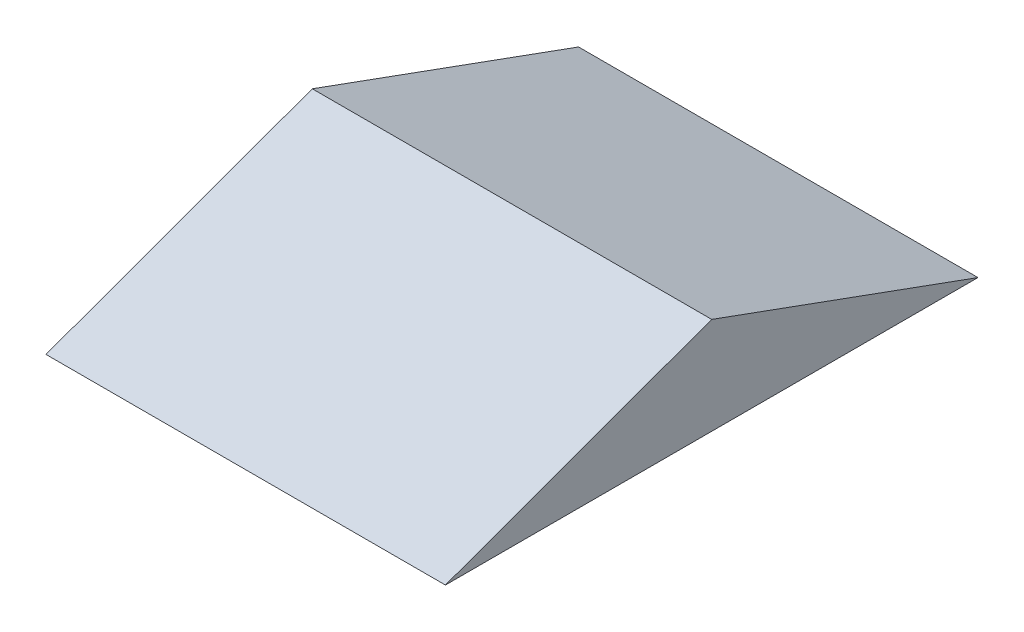
ISO-10303-21;
HEADER;
FILE_DESCRIPTION(('STEP AP214'),'2;1');
FILE_NAME('part.step','',(''),(''),'','','');
FILE_SCHEMA(('AUTOMOTIVE_DESIGN { 1 0 10303 214 1 1 1 1 }'));
ENDSEC;
DATA;
#1=APPLICATION_CONTEXT('core data for automotive mechanical design processes');
#2=APPLICATION_PROTOCOL_DEFINITION('international standard','automotive_design',2000,#1);
#3=PRODUCT_CONTEXT('',#1,'mechanical');
#4=PRODUCT('Part','Part','',(#3));
#5=PRODUCT_RELATED_PRODUCT_CATEGORY('part','',(#4));
#6=PRODUCT_DEFINITION_FORMATION('','',#4);
#7=PRODUCT_DEFINITION_CONTEXT('part definition',#1,'design');
#8=PRODUCT_DEFINITION('design','',#6,#7);
#9=PRODUCT_DEFINITION_SHAPE('','',#8);
#10=(LENGTH_UNIT() NAMED_UNIT(*) SI_UNIT(.MILLI.,.METRE.));
#11=(NAMED_UNIT(*) PLANE_ANGLE_UNIT() SI_UNIT($,.RADIAN.));
#12=(NAMED_UNIT(*) SI_UNIT($,.STERADIAN.) SOLID_ANGLE_UNIT());
#13=UNCERTAINTY_MEASURE_WITH_UNIT(LENGTH_MEASURE(1.E-05),#10,'distance_accuracy_value','');
#14=(GEOMETRIC_REPRESENTATION_CONTEXT(3) GLOBAL_UNCERTAINTY_ASSIGNED_CONTEXT((#13)) GLOBAL_UNIT_ASSIGNED_CONTEXT((#10,
#11,#12)) REPRESENTATION_CONTEXT('',''));
#15=CARTESIAN_POINT('',(0.,0.,0.));
#16=DIRECTION('',(0.,0.,1.));
#17=DIRECTION('',(1.,0.,0.));
#18=AXIS2_PLACEMENT_3D('',#15,#16,#17);
#19=CARTESIAN_POINT('',(75.,0.,100.));
#20=DIRECTION('',(0.,-0.939692620785908,-0.342020143325669));
#21=DIRECTION('',(0.,0.342020143325669,-0.939692620785908));
#22=AXIS2_PLACEMENT_3D('',#19,#20,#21);
#23=PLANE('',#22);
#24=DIRECTION('',(0.,-0.342020143325669,0.939692620785908));
#25=VECTOR('',#24,1.);
#26=CARTESIAN_POINT('',(-75.,0.,100.));
#27=LINE('',#26,#25);
#28=CARTESIAN_POINT('',(-75.,36.3970234266203,0.));
#29=VERTEX_POINT('',#28);
#30=CARTESIAN_POINT('',(-75.,0.,100.));
#31=VERTEX_POINT('',#30);
#32=EDGE_CURVE('E81',#29,#31,#27,.T.);
#33=ORIENTED_EDGE('',*,*,#32,.T.);
#34=DIRECTION('',(-1.,0.,0.));
#35=VECTOR('',#34,1.);
#36=CARTESIAN_POINT('',(75.,0.,100.));
#37=LINE('',#36,#35);
#38=CARTESIAN_POINT('',(75.,0.,100.));
#39=VERTEX_POINT('',#38);
#40=EDGE_CURVE('E11',#39,#31,#37,.T.);
#41=ORIENTED_EDGE('',*,*,#40,.F.);
#42=DIRECTION('',(0.,-0.342020143325669,0.939692620785908));
#43=VECTOR('',#42,1.);
#44=CARTESIAN_POINT('',(75.,0.,100.));
#45=LINE('',#44,#43);
#46=CARTESIAN_POINT('',(75.,36.3970234266203,0.));
#47=VERTEX_POINT('',#46);
#48=EDGE_CURVE('E74',#47,#39,#45,.T.);
#49=ORIENTED_EDGE('',*,*,#48,.F.);
#50=DIRECTION('',(-1.,0.,0.));
#51=VECTOR('',#50,1.);
#52=CARTESIAN_POINT('',(75.,36.3970234266203,0.));
#53=LINE('',#52,#51);
#54=EDGE_CURVE('E82',#47,#29,#53,.T.);
#55=ORIENTED_EDGE('',*,*,#54,.T.);
#56=EDGE_LOOP('',(#33,#41,#49,#55));
#57=FACE_BOUND('',#56,.T.);
#58=ADVANCED_FACE('F34',(#57),#23,.F.);
#59=CARTESIAN_POINT('',(75.,0.,100.));
#60=DIRECTION('',(0.,1.,0.));
#61=DIRECTION('',(0.,0.,1.));
#62=AXIS2_PLACEMENT_3D('',#59,#60,#61);
#63=PLANE('',#62);
#64=DIRECTION('',(0.,0.,-1.));
#65=VECTOR('',#64,1.);
#66=CARTESIAN_POINT('',(-75.,0.,100.));
#67=LINE('',#66,#65);
#68=CARTESIAN_POINT('',(-75.,0.,-100.));
#69=VERTEX_POINT('',#68);
#70=EDGE_CURVE('E62',#31,#69,#67,.T.);
#71=ORIENTED_EDGE('',*,*,#70,.T.);
#72=DIRECTION('',(-1.,0.,0.));
#73=VECTOR('',#72,1.);
#74=CARTESIAN_POINT('',(75.,0.,-100.));
#75=LINE('',#74,#73);
#76=CARTESIAN_POINT('',(75.,0.,-100.));
#77=VERTEX_POINT('',#76);
#78=EDGE_CURVE('E42',#77,#69,#75,.T.);
#79=ORIENTED_EDGE('',*,*,#78,.F.);
#80=DIRECTION('',(0.,0.,-1.));
#81=VECTOR('',#80,1.);
#82=CARTESIAN_POINT('',(75.,0.,100.));
#83=LINE('',#82,#81);
#84=EDGE_CURVE('E70',#39,#77,#83,.T.);
#85=ORIENTED_EDGE('',*,*,#84,.F.);
#86=ORIENTED_EDGE('',*,*,#40,.T.);
#87=EDGE_LOOP('',(#71,#79,#85,#86));
#88=FACE_BOUND('',#87,.T.);
#89=ADVANCED_FACE('F71',(#88),#63,.F.);
#90=CARTESIAN_POINT('',(75.,36.3970234266203,0.));
#91=DIRECTION('',(0.,-0.939692620785908,0.342020143325669));
#92=DIRECTION('',(0.,-0.342020143325669,-0.939692620785908));
#93=AXIS2_PLACEMENT_3D('',#90,#91,#92);
#94=PLANE('',#93);
#95=DIRECTION('',(0.,0.342020143325669,0.939692620785908));
#96=VECTOR('',#95,1.);
#97=CARTESIAN_POINT('',(-75.,36.3970234266203,0.));
#98=LINE('',#97,#96);
#99=EDGE_CURVE('E67',#69,#29,#98,.T.);
#100=ORIENTED_EDGE('',*,*,#99,.T.);
#101=ORIENTED_EDGE('',*,*,#54,.F.);
#102=DIRECTION('',(0.,0.342020143325669,0.939692620785908));
#103=VECTOR('',#102,1.);
#104=CARTESIAN_POINT('',(75.,36.3970234266203,0.));
#105=LINE('',#104,#103);
#106=EDGE_CURVE('E50',#77,#47,#105,.T.);
#107=ORIENTED_EDGE('',*,*,#106,.F.);
#108=ORIENTED_EDGE('',*,*,#78,.T.);
#109=EDGE_LOOP('',(#100,#101,#107,#108));
#110=FACE_BOUND('',#109,.T.);
#111=ADVANCED_FACE('F89',(#110),#94,.F.);
#112=CARTESIAN_POINT('',(75.,0.,0.));
#113=DIRECTION('',(-1.,0.,0.));
#114=DIRECTION('',(0.,0.,1.));
#115=AXIS2_PLACEMENT_3D('',#112,#113,#114);
#116=PLANE('',#115);
#117=ORIENTED_EDGE('',*,*,#48,.T.);
#118=ORIENTED_EDGE('',*,*,#84,.T.);
#119=ORIENTED_EDGE('',*,*,#106,.T.);
#120=EDGE_LOOP('',(#117,#118,#119));
#121=FACE_BOUND('',#120,.T.);
#122=ADVANCED_FACE('F77',(#121),#116,.F.);
#123=CARTESIAN_POINT('',(-75.,0.,0.));
#124=DIRECTION('',(-1.,0.,0.));
#125=DIRECTION('',(0.,0.,1.));
#126=AXIS2_PLACEMENT_3D('',#123,#124,#125);
#127=PLANE('',#126);
#128=ORIENTED_EDGE('',*,*,#32,.F.);
#129=ORIENTED_EDGE('',*,*,#99,.F.);
#130=ORIENTED_EDGE('',*,*,#70,.F.);
#131=EDGE_LOOP('',(#128,#129,#130));
#132=FACE_BOUND('',#131,.T.);
#133=ADVANCED_FACE('F90',(#132),#127,.T.);
#134=CLOSED_SHELL('',(#58,#89,#111,#122,#133));
#135=MANIFOLD_SOLID_BREP('B2',#134);
#136=ADVANCED_BREP_SHAPE_REPRESENTATION('',(#18,#135),#14);
#137=SHAPE_DEFINITION_REPRESENTATION(#9,#136);
ENDSEC;
END-ISO-10303-21;
